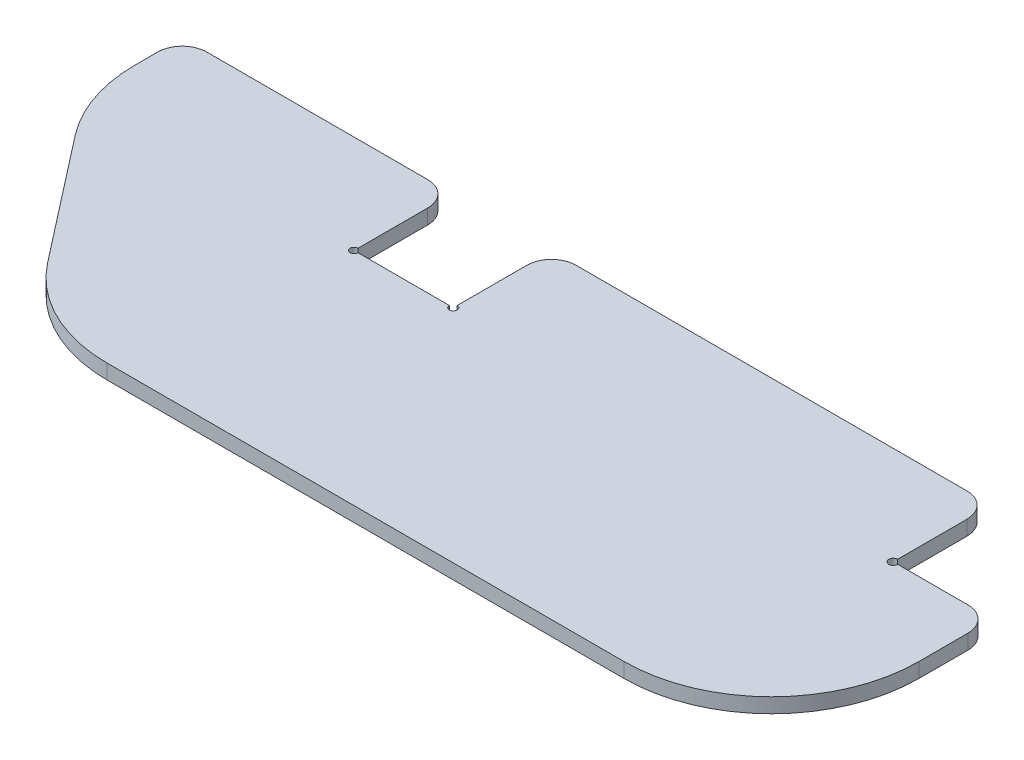
ISO-10303-21;
HEADER;
FILE_DESCRIPTION(('STEP AP214'),'2;1');
FILE_NAME('part.step','',(''),(''),'','','');
FILE_SCHEMA(('AUTOMOTIVE_DESIGN { 1 0 10303 214 1 1 1 1 }'));
ENDSEC;
DATA;
#1=APPLICATION_CONTEXT('core data for automotive mechanical design processes');
#2=APPLICATION_PROTOCOL_DEFINITION('international standard','automotive_design',2000,#1);
#3=PRODUCT_CONTEXT('',#1,'mechanical');
#4=PRODUCT('Part','Part','',(#3));
#5=PRODUCT_RELATED_PRODUCT_CATEGORY('part','',(#4));
#6=PRODUCT_DEFINITION_FORMATION('','',#4);
#7=PRODUCT_DEFINITION_CONTEXT('part definition',#1,'design');
#8=PRODUCT_DEFINITION('design','',#6,#7);
#9=PRODUCT_DEFINITION_SHAPE('','',#8);
#10=(LENGTH_UNIT() NAMED_UNIT(*) SI_UNIT(.MILLI.,.METRE.));
#11=(NAMED_UNIT(*) PLANE_ANGLE_UNIT() SI_UNIT($,.RADIAN.));
#12=(NAMED_UNIT(*) SI_UNIT($,.STERADIAN.) SOLID_ANGLE_UNIT());
#13=UNCERTAINTY_MEASURE_WITH_UNIT(LENGTH_MEASURE(1.E-05),#10,'distance_accuracy_value','');
#14=(GEOMETRIC_REPRESENTATION_CONTEXT(3) GLOBAL_UNCERTAINTY_ASSIGNED_CONTEXT((#13)) GLOBAL_UNIT_ASSIGNED_CONTEXT((#10,
#11,#12)) REPRESENTATION_CONTEXT('',''));
#15=CARTESIAN_POINT('',(0.,0.,0.));
#16=DIRECTION('',(0.,0.,1.));
#17=DIRECTION('',(1.,0.,0.));
#18=AXIS2_PLACEMENT_3D('',#15,#16,#17);
#19=CARTESIAN_POINT('',(-75.,3.,-22.5));
#20=DIRECTION('',(0.,0.,1.));
#21=DIRECTION('',(1.,0.,0.));
#22=AXIS2_PLACEMENT_3D('',#19,#20,#21);
#23=PLANE('',#22);
#24=DIRECTION('',(-1.,0.,0.));
#25=VECTOR('',#24,1.);
#26=CARTESIAN_POINT('',(-75.,0.,-22.5));
#27=LINE('',#26,#25);
#28=CARTESIAN_POINT('',(-35.6,0.,-22.5));
#29=VERTEX_POINT('',#28);
#30=CARTESIAN_POINT('',(-54.2,0.,-22.5));
#31=VERTEX_POINT('',#30);
#32=EDGE_CURVE('E271',#29,#31,#27,.T.);
#33=ORIENTED_EDGE('',*,*,#32,.T.);
#34=DIRECTION('',(0.,1.,0.));
#35=VECTOR('',#34,1.);
#36=CARTESIAN_POINT('',(-54.2,0.,-22.5));
#37=LINE('',#36,#35);
#38=CARTESIAN_POINT('',(-54.2,3.,-22.5));
#39=VERTEX_POINT('',#38);
#40=EDGE_CURVE('E215',#31,#39,#37,.T.);
#41=ORIENTED_EDGE('',*,*,#40,.T.);
#42=DIRECTION('',(-1.,0.,0.));
#43=VECTOR('',#42,1.);
#44=CARTESIAN_POINT('',(-75.,3.,-22.5));
#45=LINE('',#44,#43);
#46=CARTESIAN_POINT('',(-35.6,3.,-22.5));
#47=VERTEX_POINT('',#46);
#48=EDGE_CURVE('E197',#47,#39,#45,.T.);
#49=ORIENTED_EDGE('',*,*,#48,.F.);
#50=DIRECTION('',(0.,1.,0.));
#51=VECTOR('',#50,1.);
#52=CARTESIAN_POINT('',(-35.6,0.,-22.5));
#53=LINE('',#52,#51);
#54=EDGE_CURVE('E211',#47,#29,#53,.F.);
#55=ORIENTED_EDGE('',*,*,#54,.T.);
#56=EDGE_LOOP('',(#33,#41,#49,#55));
#57=FACE_BOUND('',#56,.T.);
#58=ADVANCED_FACE('F35',(#57),#23,.F.);
#59=CARTESIAN_POINT('',(75.,3.,22.5));
#60=DIRECTION('',(-1.,0.,0.));
#61=DIRECTION('',(0.,0.,1.));
#62=AXIS2_PLACEMENT_3D('',#59,#60,#61);
#63=PLANE('',#62);
#64=DIRECTION('',(0.,0.,-1.));
#65=VECTOR('',#64,1.);
#66=CARTESIAN_POINT('',(75.,0.,22.5));
#67=LINE('',#66,#65);
#68=CARTESIAN_POINT('',(75.,0.,-7.49999999999999));
#69=VERTEX_POINT('',#68);
#70=CARTESIAN_POINT('',(75.,0.,-17.5));
#71=VERTEX_POINT('',#70);
#72=EDGE_CURVE('E253',#69,#71,#67,.T.);
#73=ORIENTED_EDGE('',*,*,#72,.T.);
#74=DIRECTION('',(0.,-1.,0.));
#75=VECTOR('',#74,1.);
#76=CARTESIAN_POINT('',(75.,3.,-17.5));
#77=LINE('',#76,#75);
#78=CARTESIAN_POINT('',(75.,3.,-17.5));
#79=VERTEX_POINT('',#78);
#80=EDGE_CURVE('E320',#71,#79,#77,.F.);
#81=ORIENTED_EDGE('',*,*,#80,.T.);
#82=DIRECTION('',(0.,0.,-1.));
#83=VECTOR('',#82,1.);
#84=CARTESIAN_POINT('',(75.,3.,22.5));
#85=LINE('',#84,#83);
#86=CARTESIAN_POINT('',(75.,3.,-7.49999999999999));
#87=VERTEX_POINT('',#86);
#88=EDGE_CURVE('E264',#87,#79,#85,.T.);
#89=ORIENTED_EDGE('',*,*,#88,.F.);
#90=DIRECTION('',(0.,-1.,0.));
#91=VECTOR('',#90,1.);
#92=CARTESIAN_POINT('',(75.,3.,-7.5));
#93=LINE('',#92,#91);
#94=EDGE_CURVE('E268',#87,#69,#93,.T.);
#95=ORIENTED_EDGE('',*,*,#94,.T.);
#96=EDGE_LOOP('',(#73,#81,#89,#95));
#97=FACE_BOUND('',#96,.T.);
#98=ADVANCED_FACE('F407',(#97),#63,.F.);
#99=CARTESIAN_POINT('',(70.,3.,-22.5));
#100=VERTEX_POINT('',#99);
#101=CARTESIAN_POINT('',(55.6994021051871,3.,-22.5));
#102=VERTEX_POINT('',#101);
#103=EDGE_CURVE('E183',#100,#102,#45,.T.);
#104=ORIENTED_EDGE('',*,*,#103,.F.);
#105=DIRECTION('',(0.,-1.,0.));
#106=VECTOR('',#105,1.);
#107=CARTESIAN_POINT('',(70.,3.,-22.5));
#108=LINE('',#107,#106);
#109=CARTESIAN_POINT('',(70.,0.,-22.5));
#110=VERTEX_POINT('',#109);
#111=EDGE_CURVE('E308',#100,#110,#108,.T.);
#112=ORIENTED_EDGE('',*,*,#111,.T.);
#113=CARTESIAN_POINT('',(55.6994021051871,0.,-22.5));
#114=VERTEX_POINT('',#113);
#115=EDGE_CURVE('E210',#110,#114,#27,.T.);
#116=ORIENTED_EDGE('',*,*,#115,.T.);
#117=DIRECTION('',(0.,1.,0.));
#118=VECTOR('',#117,1.);
#119=CARTESIAN_POINT('',(55.6994021051871,0.,-22.5));
#120=LINE('',#119,#118);
#121=EDGE_CURVE('E202',#114,#102,#120,.T.);
#122=ORIENTED_EDGE('',*,*,#121,.T.);
#123=EDGE_LOOP('',(#104,#112,#116,#122));
#124=FACE_BOUND('',#123,.T.);
#125=ADVANCED_FACE('F208',(#124),#23,.F.);
#126=CARTESIAN_POINT('',(-75.,3.,22.5));
#127=DIRECTION('',(0.,0.,-1.));
#128=DIRECTION('',(-1.,0.,0.));
#129=AXIS2_PLACEMENT_3D('',#126,#127,#128);
#130=PLANE('',#129);
#131=DIRECTION('',(1.,0.,0.));
#132=VECTOR('',#131,1.);
#133=CARTESIAN_POINT('',(-75.,3.,22.5));
#134=LINE('',#133,#132);
#135=CARTESIAN_POINT('',(-60.3274858300287,3.,22.5));
#136=VERTEX_POINT('',#135);
#137=CARTESIAN_POINT('',(45.,3.,22.5));
#138=VERTEX_POINT('',#137);
#139=EDGE_CURVE('E196',#136,#138,#134,.T.);
#140=ORIENTED_EDGE('',*,*,#139,.F.);
#141=DIRECTION('',(0.,-1.,0.));
#142=VECTOR('',#141,1.);
#143=CARTESIAN_POINT('',(-60.3274858300287,0.,22.5));
#144=LINE('',#143,#142);
#145=CARTESIAN_POINT('',(-60.3274858300287,0.,22.5));
#146=VERTEX_POINT('',#145);
#147=EDGE_CURVE('E284',#136,#146,#144,.T.);
#148=ORIENTED_EDGE('',*,*,#147,.T.);
#149=DIRECTION('',(1.,0.,0.));
#150=VECTOR('',#149,1.);
#151=CARTESIAN_POINT('',(-75.,0.,22.5));
#152=LINE('',#151,#150);
#153=CARTESIAN_POINT('',(45.,0.,22.5));
#154=VERTEX_POINT('',#153);
#155=EDGE_CURVE('E265',#146,#154,#152,.T.);
#156=ORIENTED_EDGE('',*,*,#155,.T.);
#157=DIRECTION('',(0.,-1.,0.));
#158=VECTOR('',#157,1.);
#159=CARTESIAN_POINT('',(45.,3.,22.5));
#160=LINE('',#159,#158);
#161=EDGE_CURVE('E279',#154,#138,#160,.F.);
#162=ORIENTED_EDGE('',*,*,#161,.T.);
#163=EDGE_LOOP('',(#140,#148,#156,#162));
#164=FACE_BOUND('',#163,.T.);
#165=ADVANCED_FACE('F418',(#164),#130,.F.);
#166=CARTESIAN_POINT('',(0.,3.,0.));
#167=DIRECTION('',(0.,-1.,0.));
#168=DIRECTION('',(0.,0.,-1.));
#169=AXIS2_PLACEMENT_3D('',#166,#167,#168);
#170=PLANE('',#169);
#171=ORIENTED_EDGE('',*,*,#88,.T.);
#172=CARTESIAN_POINT('',(70.,3.,-17.5));
#173=DIRECTION('',(0.,-1.,0.));
#174=DIRECTION('',(0.,0.,-1.));
#175=AXIS2_PLACEMENT_3D('',#172,#173,#174);
#176=CIRCLE('',#175,5.);
#177=EDGE_CURVE('E191',#79,#100,#176,.F.);
#178=ORIENTED_EDGE('',*,*,#177,.T.);
#179=ORIENTED_EDGE('',*,*,#103,.T.);
#180=CARTESIAN_POINT('',(54.8,3.,-22.5));
#181=DIRECTION('',(0.,1.,0.));
#182=DIRECTION('',(0.,0.,1.));
#183=AXIS2_PLACEMENT_3D('',#180,#181,#182);
#184=CIRCLE('',#183,0.899402105187145);
#185=CARTESIAN_POINT('',(54.8,3.,-23.3994021051871));
#186=VERTEX_POINT('',#185);
#187=EDGE_CURVE('E188',#186,#102,#184,.T.);
#188=ORIENTED_EDGE('',*,*,#187,.F.);
#189=DIRECTION('',(0.,0.,-1.));
#190=VECTOR('',#189,1.);
#191=CARTESIAN_POINT('',(54.8,3.,0.));
#192=LINE('',#191,#190);
#193=CARTESIAN_POINT('',(54.8,3.,-37.5));
#194=VERTEX_POINT('',#193);
#195=EDGE_CURVE('E228',#186,#194,#192,.T.);
#196=ORIENTED_EDGE('',*,*,#195,.T.);
#197=CARTESIAN_POINT('',(49.8,3.,-37.5));
#198=DIRECTION('',(0.,-1.,0.));
#199=DIRECTION('',(0.,0.,-1.));
#200=AXIS2_PLACEMENT_3D('',#197,#198,#199);
#201=CIRCLE('',#200,5.);
#202=CARTESIAN_POINT('',(49.8,3.,-42.5));
#203=VERTEX_POINT('',#202);
#204=EDGE_CURVE('E327',#194,#203,#201,.F.);
#205=ORIENTED_EDGE('',*,*,#204,.T.);
#206=DIRECTION('',(-1.,0.,0.));
#207=VECTOR('',#206,1.);
#208=CARTESIAN_POINT('',(0.,3.,-42.5));
#209=LINE('',#208,#207);
#210=CARTESIAN_POINT('',(-29.8,3.,-42.5));
#211=VERTEX_POINT('',#210);
#212=EDGE_CURVE('E225',#203,#211,#209,.T.);
#213=ORIENTED_EDGE('',*,*,#212,.T.);
#214=CARTESIAN_POINT('',(-29.8,3.,-37.5));
#215=DIRECTION('',(0.,-1.,0.));
#216=DIRECTION('',(0.,0.,-1.));
#217=AXIS2_PLACEMENT_3D('',#214,#215,#216);
#218=CIRCLE('',#217,5.);
#219=CARTESIAN_POINT('',(-34.8,3.,-37.5));
#220=VERTEX_POINT('',#219);
#221=EDGE_CURVE('E50',#211,#220,#218,.F.);
#222=ORIENTED_EDGE('',*,*,#221,.T.);
#223=DIRECTION('',(0.,0.,-1.));
#224=VECTOR('',#223,1.);
#225=CARTESIAN_POINT('',(-34.8,3.,0.));
#226=LINE('',#225,#224);
#227=CARTESIAN_POINT('',(-34.8,3.,-23.3));
#228=VERTEX_POINT('',#227);
#229=EDGE_CURVE('E224',#228,#220,#226,.T.);
#230=ORIENTED_EDGE('',*,*,#229,.F.);
#231=CARTESIAN_POINT('',(-34.8,3.,-22.5));
#232=DIRECTION('',(0.,1.,0.));
#233=DIRECTION('',(0.,0.,1.));
#234=AXIS2_PLACEMENT_3D('',#231,#232,#233);
#235=CIRCLE('',#234,0.800000000000003);
#236=EDGE_CURVE('E370',#47,#228,#235,.T.);
#237=ORIENTED_EDGE('',*,*,#236,.F.);
#238=ORIENTED_EDGE('',*,*,#48,.T.);
#239=CARTESIAN_POINT('',(-55.,3.,-22.5));
#240=DIRECTION('',(0.,1.,0.));
#241=DIRECTION('',(0.,0.,1.));
#242=AXIS2_PLACEMENT_3D('',#239,#240,#241);
#243=CIRCLE('',#242,0.800000000000003);
#244=CARTESIAN_POINT('',(-55.,3.,-23.3));
#245=VERTEX_POINT('',#244);
#246=EDGE_CURVE('E218',#245,#39,#243,.T.);
#247=ORIENTED_EDGE('',*,*,#246,.F.);
#248=DIRECTION('',(0.,0.,-1.));
#249=VECTOR('',#248,1.);
#250=CARTESIAN_POINT('',(-55.,3.,0.));
#251=LINE('',#250,#249);
#252=CARTESIAN_POINT('',(-55.,3.,-37.5));
#253=VERTEX_POINT('',#252);
#254=EDGE_CURVE('E244',#245,#253,#251,.T.);
#255=ORIENTED_EDGE('',*,*,#254,.T.);
#256=CARTESIAN_POINT('',(-60.,3.,-37.5));
#257=DIRECTION('',(0.,-1.,0.));
#258=DIRECTION('',(0.,0.,-1.));
#259=AXIS2_PLACEMENT_3D('',#256,#257,#258);
#260=CIRCLE('',#259,5.);
#261=CARTESIAN_POINT('',(-60.,3.,-42.5));
#262=VERTEX_POINT('',#261);
#263=EDGE_CURVE('E324',#253,#262,#260,.F.);
#264=ORIENTED_EDGE('',*,*,#263,.T.);
#265=DIRECTION('',(-1.,0.,0.));
#266=VECTOR('',#265,1.);
#267=CARTESIAN_POINT('',(0.,3.,-42.5));
#268=LINE('',#267,#266);
#269=CARTESIAN_POINT('',(-105.,3.,-42.5));
#270=VERTEX_POINT('',#269);
#271=EDGE_CURVE('E240',#262,#270,#268,.T.);
#272=ORIENTED_EDGE('',*,*,#271,.T.);
#273=CARTESIAN_POINT('',(-105.,3.,-37.5));
#274=DIRECTION('',(0.,-1.,0.));
#275=DIRECTION('',(0.,0.,-1.));
#276=AXIS2_PLACEMENT_3D('',#273,#274,#275);
#277=CIRCLE('',#276,5.);
#278=CARTESIAN_POINT('',(-110.,3.,-37.5));
#279=VERTEX_POINT('',#278);
#280=EDGE_CURVE('E322',#270,#279,#277,.F.);
#281=ORIENTED_EDGE('',*,*,#280,.T.);
#282=DIRECTION('',(0.,0.,-1.));
#283=VECTOR('',#282,1.);
#284=CARTESIAN_POINT('',(-110.,3.,0.));
#285=LINE('',#284,#283);
#286=CARTESIAN_POINT('',(-110.,3.,-32.7932325042487));
#287=VERTEX_POINT('',#286);
#288=EDGE_CURVE('E250',#287,#279,#285,.T.);
#289=ORIENTED_EDGE('',*,*,#288,.F.);
#290=CARTESIAN_POINT('',(-80.,3.,-32.7932325042487));
#291=DIRECTION('',(0.,-1.,0.));
#292=DIRECTION('',(0.,0.,-1.));
#293=AXIS2_PLACEMENT_3D('',#290,#291,#292);
#294=CIRCLE('',#293,30.);
#295=CARTESIAN_POINT('',(-103.68056652129,3.,-14.3750140988011));
#296=VERTEX_POINT('',#295);
#297=EDGE_CURVE('E295',#287,#296,#294,.F.);
#298=ORIENTED_EDGE('',*,*,#297,.T.);
#299=DIRECTION('',(0.613940613514921,0.,0.789352217376326));
#300=VECTOR('',#299,1.);
#301=CARTESIAN_POINT('',(-57.6346153846154,3.,44.8269230769231));
#302=LINE('',#301,#300);
#303=CARTESIAN_POINT('',(-84.0080523513185,3.,10.9182184054476));
#304=VERTEX_POINT('',#303);
#305=EDGE_CURVE('E247',#296,#304,#302,.T.);
#306=ORIENTED_EDGE('',*,*,#305,.T.);
#307=CARTESIAN_POINT('',(-60.3274858300287,3.,-7.5));
#308=DIRECTION('',(0.,-1.,0.));
#309=DIRECTION('',(0.,0.,-1.));
#310=AXIS2_PLACEMENT_3D('',#307,#308,#309);
#311=CIRCLE('',#310,30.);
#312=EDGE_CURVE('E297',#304,#136,#311,.F.);
#313=ORIENTED_EDGE('',*,*,#312,.T.);
#314=ORIENTED_EDGE('',*,*,#139,.T.);
#315=CARTESIAN_POINT('',(45.,3.,-7.5));
#316=DIRECTION('',(0.,-1.,0.));
#317=DIRECTION('',(0.,0.,-1.));
#318=AXIS2_PLACEMENT_3D('',#315,#316,#317);
#319=CIRCLE('',#318,30.);
#320=EDGE_CURVE('E282',#138,#87,#319,.F.);
#321=ORIENTED_EDGE('',*,*,#320,.T.);
#322=EDGE_LOOP('',(#171,#178,#179,#188,#196,#205,#213,#222,#230,#237,#238,#247,#255,#264,#272,
#281,#289,#298,#306,#313,#314,#321));
#323=FACE_BOUND('',#322,.T.);
#324=ADVANCED_FACE('F186',(#323),#170,.F.);
#325=CARTESIAN_POINT('',(0.,0.,0.));
#326=DIRECTION('',(0.,-1.,0.));
#327=DIRECTION('',(0.,0.,-1.));
#328=AXIS2_PLACEMENT_3D('',#325,#326,#327);
#329=PLANE('',#328);
#330=ORIENTED_EDGE('',*,*,#115,.F.);
#331=CARTESIAN_POINT('',(70.,0.,-17.5));
#332=DIRECTION('',(0.,-1.,0.));
#333=DIRECTION('',(0.,0.,-1.));
#334=AXIS2_PLACEMENT_3D('',#331,#332,#333);
#335=CIRCLE('',#334,5.);
#336=EDGE_CURVE('E318',#110,#71,#335,.T.);
#337=ORIENTED_EDGE('',*,*,#336,.T.);
#338=ORIENTED_EDGE('',*,*,#72,.F.);
#339=CARTESIAN_POINT('',(45.,0.,-7.5));
#340=DIRECTION('',(0.,-1.,0.));
#341=DIRECTION('',(0.,0.,-1.));
#342=AXIS2_PLACEMENT_3D('',#339,#340,#341);
#343=CIRCLE('',#342,30.);
#344=EDGE_CURVE('E276',#69,#154,#343,.T.);
#345=ORIENTED_EDGE('',*,*,#344,.T.);
#346=ORIENTED_EDGE('',*,*,#155,.F.);
#347=CARTESIAN_POINT('',(-60.3274858300287,0.,-7.5));
#348=DIRECTION('',(0.,-1.,0.));
#349=DIRECTION('',(0.,0.,-1.));
#350=AXIS2_PLACEMENT_3D('',#347,#348,#349);
#351=CIRCLE('',#350,30.);
#352=CARTESIAN_POINT('',(-84.0080523513185,0.,10.9182184054476));
#353=VERTEX_POINT('',#352);
#354=EDGE_CURVE('E289',#146,#353,#351,.T.);
#355=ORIENTED_EDGE('',*,*,#354,.T.);
#356=DIRECTION('',(0.613940613514921,0.,0.789352217376326));
#357=VECTOR('',#356,1.);
#358=CARTESIAN_POINT('',(-57.6346153846154,0.,44.8269230769231));
#359=LINE('',#358,#357);
#360=CARTESIAN_POINT('',(-103.68056652129,0.,-14.3750140988012));
#361=VERTEX_POINT('',#360);
#362=EDGE_CURVE('E243',#361,#353,#359,.T.);
#363=ORIENTED_EDGE('',*,*,#362,.F.);
#364=CARTESIAN_POINT('',(-80.,0.,-32.7932325042487));
#365=DIRECTION('',(0.,-1.,0.));
#366=DIRECTION('',(0.,0.,-1.));
#367=AXIS2_PLACEMENT_3D('',#364,#365,#366);
#368=CIRCLE('',#367,30.);
#369=CARTESIAN_POINT('',(-110.,0.,-32.7932325042487));
#370=VERTEX_POINT('',#369);
#371=EDGE_CURVE('E287',#361,#370,#368,.T.);
#372=ORIENTED_EDGE('',*,*,#371,.T.);
#373=DIRECTION('',(0.,0.,-1.));
#374=VECTOR('',#373,1.);
#375=CARTESIAN_POINT('',(-110.,0.,0.));
#376=LINE('',#375,#374);
#377=CARTESIAN_POINT('',(-110.,0.,-37.5));
#378=VERTEX_POINT('',#377);
#379=EDGE_CURVE('E239',#370,#378,#376,.T.);
#380=ORIENTED_EDGE('',*,*,#379,.T.);
#381=CARTESIAN_POINT('',(-105.,0.,-37.5));
#382=DIRECTION('',(0.,-1.,0.));
#383=DIRECTION('',(0.,0.,-1.));
#384=AXIS2_PLACEMENT_3D('',#381,#382,#383);
#385=CIRCLE('',#384,5.);
#386=CARTESIAN_POINT('',(-105.,0.,-42.5));
#387=VERTEX_POINT('',#386);
#388=EDGE_CURVE('E310',#378,#387,#385,.T.);
#389=ORIENTED_EDGE('',*,*,#388,.T.);
#390=DIRECTION('',(-1.,0.,0.));
#391=VECTOR('',#390,1.);
#392=CARTESIAN_POINT('',(0.,0.,-42.5));
#393=LINE('',#392,#391);
#394=CARTESIAN_POINT('',(-60.,0.,-42.5));
#395=VERTEX_POINT('',#394);
#396=EDGE_CURVE('E254',#395,#387,#393,.T.);
#397=ORIENTED_EDGE('',*,*,#396,.F.);
#398=CARTESIAN_POINT('',(-60.,0.,-37.5));
#399=DIRECTION('',(0.,-1.,0.));
#400=DIRECTION('',(0.,0.,-1.));
#401=AXIS2_PLACEMENT_3D('',#398,#399,#400);
#402=CIRCLE('',#401,5.);
#403=CARTESIAN_POINT('',(-55.,0.,-37.5));
#404=VERTEX_POINT('',#403);
#405=EDGE_CURVE('E312',#395,#404,#402,.T.);
#406=ORIENTED_EDGE('',*,*,#405,.T.);
#407=DIRECTION('',(0.,0.,-1.));
#408=VECTOR('',#407,1.);
#409=CARTESIAN_POINT('',(-55.,0.,0.));
#410=LINE('',#409,#408);
#411=CARTESIAN_POINT('',(-55.,0.,-23.3));
#412=VERTEX_POINT('',#411);
#413=EDGE_CURVE('E257',#412,#404,#410,.T.);
#414=ORIENTED_EDGE('',*,*,#413,.F.);
#415=CARTESIAN_POINT('',(-55.,0.,-22.5));
#416=DIRECTION('',(0.,1.,0.));
#417=DIRECTION('',(0.,0.,1.));
#418=AXIS2_PLACEMENT_3D('',#415,#416,#417);
#419=CIRCLE('',#418,0.800000000000003);
#420=EDGE_CURVE('E212',#412,#31,#419,.T.);
#421=ORIENTED_EDGE('',*,*,#420,.T.);
#422=ORIENTED_EDGE('',*,*,#32,.F.);
#423=CARTESIAN_POINT('',(-34.8,0.,-22.5));
#424=DIRECTION('',(0.,1.,0.));
#425=DIRECTION('',(0.,0.,1.));
#426=AXIS2_PLACEMENT_3D('',#423,#424,#425);
#427=CIRCLE('',#426,0.800000000000003);
#428=CARTESIAN_POINT('',(-34.8,0.,-23.3));
#429=VERTEX_POINT('',#428);
#430=EDGE_CURVE('E367',#29,#429,#427,.T.);
#431=ORIENTED_EDGE('',*,*,#430,.T.);
#432=DIRECTION('',(0.,0.,-1.));
#433=VECTOR('',#432,1.);
#434=CARTESIAN_POINT('',(-34.8,0.,0.));
#435=LINE('',#434,#433);
#436=CARTESIAN_POINT('',(-34.8,0.,-37.5));
#437=VERTEX_POINT('',#436);
#438=EDGE_CURVE('E227',#429,#437,#435,.T.);
#439=ORIENTED_EDGE('',*,*,#438,.T.);
#440=CARTESIAN_POINT('',(-29.8,0.,-37.5));
#441=DIRECTION('',(0.,-1.,0.));
#442=DIRECTION('',(0.,0.,-1.));
#443=AXIS2_PLACEMENT_3D('',#440,#441,#442);
#444=CIRCLE('',#443,5.);
#445=CARTESIAN_POINT('',(-29.8,0.,-42.5));
#446=VERTEX_POINT('',#445);
#447=EDGE_CURVE('E314',#437,#446,#444,.T.);
#448=ORIENTED_EDGE('',*,*,#447,.T.);
#449=DIRECTION('',(-1.,0.,0.));
#450=VECTOR('',#449,1.);
#451=CARTESIAN_POINT('',(0.,0.,-42.5));
#452=LINE('',#451,#450);
#453=CARTESIAN_POINT('',(49.8,0.,-42.5));
#454=VERTEX_POINT('',#453);
#455=EDGE_CURVE('E232',#454,#446,#452,.T.);
#456=ORIENTED_EDGE('',*,*,#455,.F.);
#457=CARTESIAN_POINT('',(49.8,0.,-37.5));
#458=DIRECTION('',(0.,-1.,0.));
#459=DIRECTION('',(0.,0.,-1.));
#460=AXIS2_PLACEMENT_3D('',#457,#458,#459);
#461=CIRCLE('',#460,5.);
#462=CARTESIAN_POINT('',(54.8,0.,-37.5));
#463=VERTEX_POINT('',#462);
#464=EDGE_CURVE('E316',#454,#463,#461,.T.);
#465=ORIENTED_EDGE('',*,*,#464,.T.);
#466=DIRECTION('',(0.,0.,-1.));
#467=VECTOR('',#466,1.);
#468=CARTESIAN_POINT('',(54.8,0.,0.));
#469=LINE('',#468,#467);
#470=CARTESIAN_POINT('',(54.8,0.,-23.3994021051871));
#471=VERTEX_POINT('',#470);
#472=EDGE_CURVE('E230',#471,#463,#469,.T.);
#473=ORIENTED_EDGE('',*,*,#472,.F.);
#474=CARTESIAN_POINT('',(54.8,0.,-22.5));
#475=DIRECTION('',(0.,1.,0.));
#476=DIRECTION('',(0.,0.,1.));
#477=AXIS2_PLACEMENT_3D('',#474,#475,#476);
#478=CIRCLE('',#477,0.899402105187145);
#479=EDGE_CURVE('E206',#471,#114,#478,.T.);
#480=ORIENTED_EDGE('',*,*,#479,.T.);
#481=EDGE_LOOP('',(#330,#337,#338,#345,#346,#355,#363,#372,#380,#389,#397,#406,#414,#421,#422,
#431,#439,#448,#456,#465,#473,#480));
#482=FACE_BOUND('',#481,.T.);
#483=ADVANCED_FACE('F353',(#482),#329,.T.);
#484=CARTESIAN_POINT('',(45.,3.,-7.5));
#485=DIRECTION('',(0.,-1.,0.));
#486=DIRECTION('',(0.,0.,-1.));
#487=AXIS2_PLACEMENT_3D('',#484,#485,#486);
#488=CYLINDRICAL_SURFACE('',#487,30.);
#489=ORIENTED_EDGE('',*,*,#320,.F.);
#490=ORIENTED_EDGE('',*,*,#161,.F.);
#491=ORIENTED_EDGE('',*,*,#344,.F.);
#492=ORIENTED_EDGE('',*,*,#94,.F.);
#493=EDGE_LOOP('',(#489,#490,#491,#492));
#494=FACE_BOUND('',#493,.T.);
#495=ADVANCED_FACE('F432',(#494),#488,.T.);
#496=CARTESIAN_POINT('',(-57.6346153846154,-91.8050107564941,44.8269230769231));
#497=DIRECTION('',(-0.789352217376326,0.,0.61394061351492));
#498=DIRECTION('',(0.613940613514921,0.,0.789352217376326));
#499=AXIS2_PLACEMENT_3D('',#496,#497,#498);
#500=PLANE('',#499);
#501=ORIENTED_EDGE('',*,*,#362,.T.);
#502=DIRECTION('',(0.,-1.,0.));
#503=VECTOR('',#502,1.);
#504=CARTESIAN_POINT('',(-84.0080523513185,3.,10.9182184054476));
#505=LINE('',#504,#503);
#506=EDGE_CURVE('E293',#353,#304,#505,.F.);
#507=ORIENTED_EDGE('',*,*,#506,.T.);
#508=ORIENTED_EDGE('',*,*,#305,.F.);
#509=DIRECTION('',(0.,1.,0.));
#510=VECTOR('',#509,1.);
#511=CARTESIAN_POINT('',(-103.68056652129,0.,-14.3750140988011));
#512=LINE('',#511,#510);
#513=EDGE_CURVE('E291',#296,#361,#512,.F.);
#514=ORIENTED_EDGE('',*,*,#513,.T.);
#515=EDGE_LOOP('',(#501,#507,#508,#514));
#516=FACE_BOUND('',#515,.T.);
#517=ADVANCED_FACE('F434',(#516),#500,.T.);
#518=CARTESIAN_POINT('',(-55.,-91.8050107564941,0.));
#519=DIRECTION('',(1.,0.,0.));
#520=DIRECTION('',(0.,0.,-1.));
#521=AXIS2_PLACEMENT_3D('',#518,#519,#520);
#522=PLANE('',#521);
#523=ORIENTED_EDGE('',*,*,#413,.T.);
#524=DIRECTION('',(0.,1.,0.));
#525=VECTOR('',#524,1.);
#526=CARTESIAN_POINT('',(-55.,-91.8050107564941,-37.5));
#527=LINE('',#526,#525);
#528=EDGE_CURVE('E339',#404,#253,#527,.T.);
#529=ORIENTED_EDGE('',*,*,#528,.T.);
#530=ORIENTED_EDGE('',*,*,#254,.F.);
#531=DIRECTION('',(0.,1.,0.));
#532=VECTOR('',#531,1.);
#533=CARTESIAN_POINT('',(-55.,0.,-23.3));
#534=LINE('',#533,#532);
#535=EDGE_CURVE('E306',#412,#245,#534,.T.);
#536=ORIENTED_EDGE('',*,*,#535,.F.);
#537=EDGE_LOOP('',(#523,#529,#530,#536));
#538=FACE_BOUND('',#537,.T.);
#539=ADVANCED_FACE('F360',(#538),#522,.T.);
#540=CARTESIAN_POINT('',(0.,-91.8050107564941,-42.5));
#541=DIRECTION('',(0.,0.,-1.));
#542=DIRECTION('',(-1.,0.,0.));
#543=AXIS2_PLACEMENT_3D('',#540,#541,#542);
#544=PLANE('',#543);
#545=ORIENTED_EDGE('',*,*,#271,.F.);
#546=DIRECTION('',(0.,1.,0.));
#547=VECTOR('',#546,1.);
#548=CARTESIAN_POINT('',(-60.,-91.8050107564941,-42.5));
#549=LINE('',#548,#547);
#550=EDGE_CURVE('E43',#262,#395,#549,.F.);
#551=ORIENTED_EDGE('',*,*,#550,.T.);
#552=ORIENTED_EDGE('',*,*,#396,.T.);
#553=DIRECTION('',(0.,1.,0.));
#554=VECTOR('',#553,1.);
#555=CARTESIAN_POINT('',(-105.,3.,-42.5));
#556=LINE('',#555,#554);
#557=EDGE_CURVE('E342',#387,#270,#556,.T.);
#558=ORIENTED_EDGE('',*,*,#557,.T.);
#559=EDGE_LOOP('',(#545,#551,#552,#558));
#560=FACE_BOUND('',#559,.T.);
#561=ADVANCED_FACE('F348',(#560),#544,.T.);
#562=CARTESIAN_POINT('',(-110.,-91.8050107564941,0.));
#563=DIRECTION('',(1.,0.,0.));
#564=DIRECTION('',(0.,0.,-1.));
#565=AXIS2_PLACEMENT_3D('',#562,#563,#564);
#566=PLANE('',#565);
#567=ORIENTED_EDGE('',*,*,#288,.T.);
#568=DIRECTION('',(0.,1.,0.));
#569=VECTOR('',#568,1.);
#570=CARTESIAN_POINT('',(-110.,0.,-37.5));
#571=LINE('',#570,#569);
#572=EDGE_CURVE('E11',#279,#378,#571,.F.);
#573=ORIENTED_EDGE('',*,*,#572,.T.);
#574=ORIENTED_EDGE('',*,*,#379,.F.);
#575=DIRECTION('',(0.,1.,0.));
#576=VECTOR('',#575,1.);
#577=CARTESIAN_POINT('',(-110.,3.,-32.7932325042487));
#578=LINE('',#577,#576);
#579=EDGE_CURVE('E299',#370,#287,#578,.T.);
#580=ORIENTED_EDGE('',*,*,#579,.T.);
#581=EDGE_LOOP('',(#567,#573,#574,#580));
#582=FACE_BOUND('',#581,.T.);
#583=ADVANCED_FACE('F441',(#582),#566,.F.);
#584=CARTESIAN_POINT('',(-34.8,-91.8050107564941,0.));
#585=DIRECTION('',(1.,0.,0.));
#586=DIRECTION('',(0.,0.,-1.));
#587=AXIS2_PLACEMENT_3D('',#584,#585,#586);
#588=PLANE('',#587);
#589=ORIENTED_EDGE('',*,*,#229,.T.);
#590=DIRECTION('',(0.,1.,0.));
#591=VECTOR('',#590,1.);
#592=CARTESIAN_POINT('',(-34.8,0.,-37.5));
#593=LINE('',#592,#591);
#594=EDGE_CURVE('E337',#220,#437,#593,.F.);
#595=ORIENTED_EDGE('',*,*,#594,.T.);
#596=ORIENTED_EDGE('',*,*,#438,.F.);
#597=DIRECTION('',(0.,1.,0.));
#598=VECTOR('',#597,1.);
#599=CARTESIAN_POINT('',(-34.8,0.,-23.3));
#600=LINE('',#599,#598);
#601=EDGE_CURVE('E303',#429,#228,#600,.T.);
#602=ORIENTED_EDGE('',*,*,#601,.T.);
#603=EDGE_LOOP('',(#589,#595,#596,#602));
#604=FACE_BOUND('',#603,.T.);
#605=ADVANCED_FACE('F389',(#604),#588,.F.);
#606=CARTESIAN_POINT('',(0.,-91.8050107564941,-42.5));
#607=DIRECTION('',(0.,0.,-1.));
#608=DIRECTION('',(-1.,0.,0.));
#609=AXIS2_PLACEMENT_3D('',#606,#607,#608);
#610=PLANE('',#609);
#611=ORIENTED_EDGE('',*,*,#212,.F.);
#612=DIRECTION('',(0.,1.,0.));
#613=VECTOR('',#612,1.);
#614=CARTESIAN_POINT('',(49.8,-91.8050107564941,-42.5));
#615=LINE('',#614,#613);
#616=EDGE_CURVE('E335',#203,#454,#615,.F.);
#617=ORIENTED_EDGE('',*,*,#616,.T.);
#618=ORIENTED_EDGE('',*,*,#455,.T.);
#619=DIRECTION('',(0.,1.,0.));
#620=VECTOR('',#619,1.);
#621=CARTESIAN_POINT('',(-29.8,3.,-42.5));
#622=LINE('',#621,#620);
#623=EDGE_CURVE('E333',#446,#211,#622,.T.);
#624=ORIENTED_EDGE('',*,*,#623,.T.);
#625=EDGE_LOOP('',(#611,#617,#618,#624));
#626=FACE_BOUND('',#625,.T.);
#627=ADVANCED_FACE('F381',(#626),#610,.T.);
#628=CARTESIAN_POINT('',(54.8,-91.8050107564941,0.));
#629=DIRECTION('',(1.,0.,0.));
#630=DIRECTION('',(0.,0.,-1.));
#631=AXIS2_PLACEMENT_3D('',#628,#629,#630);
#632=PLANE('',#631);
#633=ORIENTED_EDGE('',*,*,#472,.T.);
#634=DIRECTION('',(0.,1.,0.));
#635=VECTOR('',#634,1.);
#636=CARTESIAN_POINT('',(54.8,-91.8050107564941,-37.5));
#637=LINE('',#636,#635);
#638=EDGE_CURVE('E330',#463,#194,#637,.T.);
#639=ORIENTED_EDGE('',*,*,#638,.T.);
#640=ORIENTED_EDGE('',*,*,#195,.F.);
#641=DIRECTION('',(0.,1.,0.));
#642=VECTOR('',#641,1.);
#643=CARTESIAN_POINT('',(54.8,0.,-23.3994021051871));
#644=LINE('',#643,#642);
#645=EDGE_CURVE('E205',#471,#186,#644,.T.);
#646=ORIENTED_EDGE('',*,*,#645,.F.);
#647=EDGE_LOOP('',(#633,#639,#640,#646));
#648=FACE_BOUND('',#647,.T.);
#649=ADVANCED_FACE('F375',(#648),#632,.T.);
#650=CARTESIAN_POINT('',(-60.3274858300287,3.,-7.5));
#651=DIRECTION('',(0.,1.,0.));
#652=DIRECTION('',(0.,0.,1.));
#653=AXIS2_PLACEMENT_3D('',#650,#651,#652);
#654=CYLINDRICAL_SURFACE('',#653,30.);
#655=ORIENTED_EDGE('',*,*,#312,.F.);
#656=ORIENTED_EDGE('',*,*,#506,.F.);
#657=ORIENTED_EDGE('',*,*,#354,.F.);
#658=ORIENTED_EDGE('',*,*,#147,.F.);
#659=EDGE_LOOP('',(#655,#656,#657,#658));
#660=FACE_BOUND('',#659,.T.);
#661=ADVANCED_FACE('F451',(#660),#654,.T.);
#662=CARTESIAN_POINT('',(-80.,-91.8050107564941,-32.7932325042487));
#663=DIRECTION('',(0.,-1.,0.));
#664=DIRECTION('',(0.,0.,-1.));
#665=AXIS2_PLACEMENT_3D('',#662,#663,#664);
#666=CYLINDRICAL_SURFACE('',#665,30.);
#667=ORIENTED_EDGE('',*,*,#371,.F.);
#668=ORIENTED_EDGE('',*,*,#513,.F.);
#669=ORIENTED_EDGE('',*,*,#297,.F.);
#670=ORIENTED_EDGE('',*,*,#579,.F.);
#671=EDGE_LOOP('',(#667,#668,#669,#670));
#672=FACE_BOUND('',#671,.T.);
#673=ADVANCED_FACE('F453',(#672),#666,.T.);
#674=CARTESIAN_POINT('',(54.8,0.,-22.5));
#675=DIRECTION('',(0.,1.,0.));
#676=DIRECTION('',(0.,0.,1.));
#677=AXIS2_PLACEMENT_3D('',#674,#675,#676);
#678=CYLINDRICAL_SURFACE('',#677,0.899402105187145);
#679=ORIENTED_EDGE('',*,*,#479,.F.);
#680=ORIENTED_EDGE('',*,*,#645,.T.);
#681=ORIENTED_EDGE('',*,*,#187,.T.);
#682=ORIENTED_EDGE('',*,*,#121,.F.);
#683=EDGE_LOOP('',(#679,#680,#681,#682));
#684=FACE_BOUND('',#683,.T.);
#685=ADVANCED_FACE('F201',(#684),#678,.F.);
#686=CARTESIAN_POINT('',(-34.8,0.,-22.5));
#687=DIRECTION('',(0.,1.,0.));
#688=DIRECTION('',(0.,0.,1.));
#689=AXIS2_PLACEMENT_3D('',#686,#687,#688);
#690=CYLINDRICAL_SURFACE('',#689,0.800000000000003);
#691=ORIENTED_EDGE('',*,*,#236,.T.);
#692=ORIENTED_EDGE('',*,*,#601,.F.);
#693=ORIENTED_EDGE('',*,*,#430,.F.);
#694=ORIENTED_EDGE('',*,*,#54,.F.);
#695=EDGE_LOOP('',(#691,#692,#693,#694));
#696=FACE_BOUND('',#695,.T.);
#697=ADVANCED_FACE('F393',(#696),#690,.F.);
#698=CARTESIAN_POINT('',(-55.,0.,-22.5));
#699=DIRECTION('',(0.,1.,0.));
#700=DIRECTION('',(0.,0.,1.));
#701=AXIS2_PLACEMENT_3D('',#698,#699,#700);
#702=CYLINDRICAL_SURFACE('',#701,0.800000000000003);
#703=ORIENTED_EDGE('',*,*,#420,.F.);
#704=ORIENTED_EDGE('',*,*,#535,.T.);
#705=ORIENTED_EDGE('',*,*,#246,.T.);
#706=ORIENTED_EDGE('',*,*,#40,.F.);
#707=EDGE_LOOP('',(#703,#704,#705,#706));
#708=FACE_BOUND('',#707,.T.);
#709=ADVANCED_FACE('F395',(#708),#702,.F.);
#710=CARTESIAN_POINT('',(70.,3.,-17.5));
#711=DIRECTION('',(0.,-1.,0.));
#712=DIRECTION('',(0.,0.,-1.));
#713=AXIS2_PLACEMENT_3D('',#710,#711,#712);
#714=CYLINDRICAL_SURFACE('',#713,5.);
#715=ORIENTED_EDGE('',*,*,#177,.F.);
#716=ORIENTED_EDGE('',*,*,#80,.F.);
#717=ORIENTED_EDGE('',*,*,#336,.F.);
#718=ORIENTED_EDGE('',*,*,#111,.F.);
#719=EDGE_LOOP('',(#715,#716,#717,#718));
#720=FACE_BOUND('',#719,.T.);
#721=ADVANCED_FACE('F397',(#720),#714,.T.);
#722=CARTESIAN_POINT('',(49.8,-91.8050107564941,-37.5));
#723=DIRECTION('',(0.,1.,0.));
#724=DIRECTION('',(0.,0.,1.));
#725=AXIS2_PLACEMENT_3D('',#722,#723,#724);
#726=CYLINDRICAL_SURFACE('',#725,5.);
#727=ORIENTED_EDGE('',*,*,#464,.F.);
#728=ORIENTED_EDGE('',*,*,#616,.F.);
#729=ORIENTED_EDGE('',*,*,#204,.F.);
#730=ORIENTED_EDGE('',*,*,#638,.F.);
#731=EDGE_LOOP('',(#727,#728,#729,#730));
#732=FACE_BOUND('',#731,.T.);
#733=ADVANCED_FACE('F384',(#732),#726,.T.);
#734=CARTESIAN_POINT('',(-29.8,-91.8050107564941,-37.5));
#735=DIRECTION('',(0.,-1.,0.));
#736=DIRECTION('',(0.,0.,-1.));
#737=AXIS2_PLACEMENT_3D('',#734,#735,#736);
#738=CYLINDRICAL_SURFACE('',#737,5.);
#739=ORIENTED_EDGE('',*,*,#447,.F.);
#740=ORIENTED_EDGE('',*,*,#594,.F.);
#741=ORIENTED_EDGE('',*,*,#221,.F.);
#742=ORIENTED_EDGE('',*,*,#623,.F.);
#743=EDGE_LOOP('',(#739,#740,#741,#742));
#744=FACE_BOUND('',#743,.T.);
#745=ADVANCED_FACE('F386',(#744),#738,.T.);
#746=CARTESIAN_POINT('',(-60.,-91.8050107564941,-37.5));
#747=DIRECTION('',(0.,1.,0.));
#748=DIRECTION('',(0.,0.,1.));
#749=AXIS2_PLACEMENT_3D('',#746,#747,#748);
#750=CYLINDRICAL_SURFACE('',#749,5.);
#751=ORIENTED_EDGE('',*,*,#405,.F.);
#752=ORIENTED_EDGE('',*,*,#550,.F.);
#753=ORIENTED_EDGE('',*,*,#263,.F.);
#754=ORIENTED_EDGE('',*,*,#528,.F.);
#755=EDGE_LOOP('',(#751,#752,#753,#754));
#756=FACE_BOUND('',#755,.T.);
#757=ADVANCED_FACE('F357',(#756),#750,.T.);
#758=CARTESIAN_POINT('',(-105.,-91.8050107564941,-37.5));
#759=DIRECTION('',(0.,-1.,0.));
#760=DIRECTION('',(0.,0.,-1.));
#761=AXIS2_PLACEMENT_3D('',#758,#759,#760);
#762=CYLINDRICAL_SURFACE('',#761,5.);
#763=ORIENTED_EDGE('',*,*,#388,.F.);
#764=ORIENTED_EDGE('',*,*,#572,.F.);
#765=ORIENTED_EDGE('',*,*,#280,.F.);
#766=ORIENTED_EDGE('',*,*,#557,.F.);
#767=EDGE_LOOP('',(#763,#764,#765,#766));
#768=FACE_BOUND('',#767,.T.);
#769=ADVANCED_FACE('F37',(#768),#762,.T.);
#770=CLOSED_SHELL('',(#58,#98,#125,#165,#324,#483,#495,#517,#539,#561,#583,#605,#627,#649,#661,
#673,#685,#697,#709,#721,#733,#745,#757,#769));
#771=MANIFOLD_SOLID_BREP('B2',#770);
#772=ADVANCED_BREP_SHAPE_REPRESENTATION('',(#18,#771),#14);
#773=SHAPE_DEFINITION_REPRESENTATION(#9,#772);
ENDSEC;
END-ISO-10303-21;
